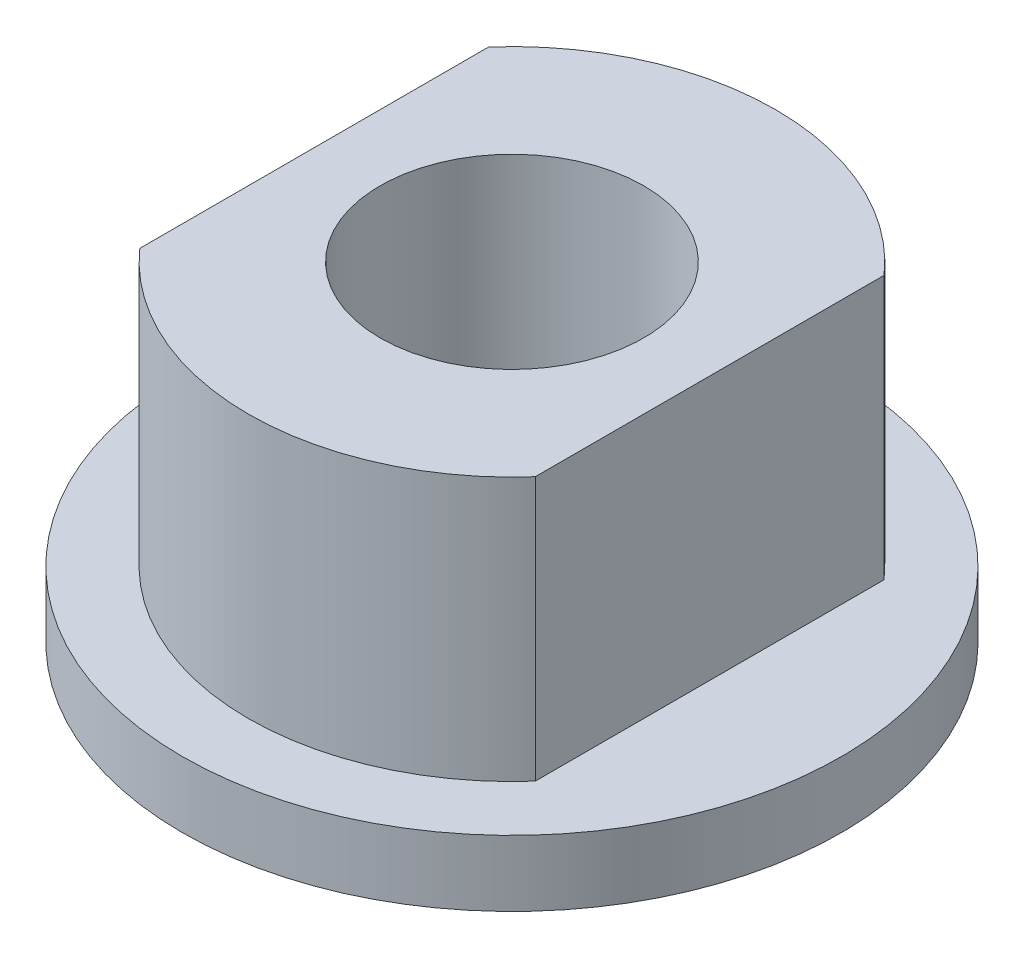
ISO-10303-21;
HEADER;
FILE_DESCRIPTION(('STEP AP214'),'2;1');
FILE_NAME('part.step','',(''),(''),'','','');
FILE_SCHEMA(('AUTOMOTIVE_DESIGN { 1 0 10303 214 1 1 1 1 }'));
ENDSEC;
DATA;
#1=APPLICATION_CONTEXT('core data for automotive mechanical design processes');
#2=APPLICATION_PROTOCOL_DEFINITION('international standard','automotive_design',2000,#1);
#3=PRODUCT_CONTEXT('',#1,'mechanical');
#4=PRODUCT('Part','Part','',(#3));
#5=PRODUCT_RELATED_PRODUCT_CATEGORY('part','',(#4));
#6=PRODUCT_DEFINITION_FORMATION('','',#4);
#7=PRODUCT_DEFINITION_CONTEXT('part definition',#1,'design');
#8=PRODUCT_DEFINITION('design','',#6,#7);
#9=PRODUCT_DEFINITION_SHAPE('','',#8);
#10=(LENGTH_UNIT() NAMED_UNIT(*) SI_UNIT(.MILLI.,.METRE.));
#11=(NAMED_UNIT(*) PLANE_ANGLE_UNIT() SI_UNIT($,.RADIAN.));
#12=(NAMED_UNIT(*) SI_UNIT($,.STERADIAN.) SOLID_ANGLE_UNIT());
#13=UNCERTAINTY_MEASURE_WITH_UNIT(LENGTH_MEASURE(1.E-05),#10,'distance_accuracy_value','');
#14=(GEOMETRIC_REPRESENTATION_CONTEXT(3) GLOBAL_UNCERTAINTY_ASSIGNED_CONTEXT((#13)) GLOBAL_UNIT_ASSIGNED_CONTEXT((#10,
#11,#12)) REPRESENTATION_CONTEXT('',''));
#15=CARTESIAN_POINT('',(0.,0.,0.));
#16=DIRECTION('',(0.,0.,1.));
#17=DIRECTION('',(1.,0.,0.));
#18=AXIS2_PLACEMENT_3D('',#15,#16,#17);
#19=CARTESIAN_POINT('',(0.,2.5,0.));
#20=DIRECTION('',(0.,-1.,0.));
#21=DIRECTION('',(0.,0.,-1.));
#22=AXIS2_PLACEMENT_3D('',#19,#20,#21);
#23=CYLINDRICAL_SURFACE('',#22,12.5);
#24=CARTESIAN_POINT('',(0.,2.5,0.));
#25=DIRECTION('',(0.,1.,0.));
#26=DIRECTION('',(0.,0.,1.));
#27=AXIS2_PLACEMENT_3D('',#24,#25,#26);
#28=CIRCLE('',#27,12.5);
#29=CARTESIAN_POINT('',(0.,2.5,12.5));
#30=VERTEX_POINT('',#29);
#31=EDGE_CURVE('E11',#30,#30,#28,.T.);
#32=ORIENTED_EDGE('',*,*,#31,.F.);
#33=EDGE_LOOP('',(#32));
#34=FACE_BOUND('',#33,.T.);
#35=CARTESIAN_POINT('',(0.,0.,0.));
#36=DIRECTION('',(0.,1.,0.));
#37=DIRECTION('',(0.,0.,1.));
#38=AXIS2_PLACEMENT_3D('',#35,#36,#37);
#39=CIRCLE('',#38,12.5);
#40=CARTESIAN_POINT('',(0.,0.,12.5));
#41=VERTEX_POINT('',#40);
#42=EDGE_CURVE('E39',#41,#41,#39,.T.);
#43=ORIENTED_EDGE('',*,*,#42,.T.);
#44=EDGE_LOOP('',(#43));
#45=FACE_BOUND('',#44,.T.);
#46=ADVANCED_FACE('F36',(#34,#45),#23,.T.);
#47=CARTESIAN_POINT('',(0.,2.5,0.));
#48=DIRECTION('',(0.,1.,0.));
#49=DIRECTION('',(0.,0.,1.));
#50=AXIS2_PLACEMENT_3D('',#47,#48,#49);
#51=PLANE('',#50);
#52=CARTESIAN_POINT('',(0.,2.5,0.));
#53=DIRECTION('',(0.,1.,0.));
#54=DIRECTION('',(0.,0.,1.));
#55=AXIS2_PLACEMENT_3D('',#52,#53,#54);
#56=CIRCLE('',#55,10.);
#57=CARTESIAN_POINT('',(-7.5,2.5,6.61437827766148));
#58=VERTEX_POINT('',#57);
#59=CARTESIAN_POINT('',(7.5,2.5,6.61437827766147));
#60=VERTEX_POINT('',#59);
#61=EDGE_CURVE('E50',#58,#60,#56,.T.);
#62=ORIENTED_EDGE('',*,*,#61,.F.);
#63=DIRECTION('',(0.,0.,1.));
#64=VECTOR('',#63,1.);
#65=CARTESIAN_POINT('',(-7.5,2.5,-6.61437827766148));
#66=LINE('',#65,#64);
#67=CARTESIAN_POINT('',(-7.5,2.5,-6.61437827766148));
#68=VERTEX_POINT('',#67);
#69=EDGE_CURVE('E54',#68,#58,#66,.T.);
#70=ORIENTED_EDGE('',*,*,#69,.F.);
#71=CARTESIAN_POINT('',(0.,2.5,0.));
#72=DIRECTION('',(0.,1.,0.));
#73=DIRECTION('',(0.,0.,1.));
#74=AXIS2_PLACEMENT_3D('',#71,#72,#73);
#75=CIRCLE('',#74,10.);
#76=CARTESIAN_POINT('',(7.5,2.5,-6.61437827766147));
#77=VERTEX_POINT('',#76);
#78=EDGE_CURVE('E106',#77,#68,#75,.T.);
#79=ORIENTED_EDGE('',*,*,#78,.F.);
#80=DIRECTION('',(0.,0.,-1.));
#81=VECTOR('',#80,1.);
#82=CARTESIAN_POINT('',(7.5,2.5,6.61437827766147));
#83=LINE('',#82,#81);
#84=EDGE_CURVE('E108',#60,#77,#83,.T.);
#85=ORIENTED_EDGE('',*,*,#84,.F.);
#86=EDGE_LOOP('',(#62,#70,#79,#85));
#87=FACE_BOUND('',#86,.T.);
#88=ORIENTED_EDGE('',*,*,#31,.T.);
#89=EDGE_LOOP('',(#88));
#90=FACE_BOUND('',#89,.T.);
#91=ADVANCED_FACE('F139',(#87,#90),#51,.T.);
#92=CARTESIAN_POINT('',(0.,0.,0.));
#93=DIRECTION('',(0.,1.,0.));
#94=DIRECTION('',(0.,0.,1.));
#95=AXIS2_PLACEMENT_3D('',#92,#93,#94);
#96=PLANE('',#95);
#97=CARTESIAN_POINT('',(0.,0.,0.));
#98=DIRECTION('',(0.,1.,0.));
#99=DIRECTION('',(0.,0.,1.));
#100=AXIS2_PLACEMENT_3D('',#97,#98,#99);
#101=CIRCLE('',#100,5.);
#102=CARTESIAN_POINT('',(0.,0.,5.));
#103=VERTEX_POINT('',#102);
#104=EDGE_CURVE('E111',#103,#103,#101,.T.);
#105=ORIENTED_EDGE('',*,*,#104,.T.);
#106=EDGE_LOOP('',(#105));
#107=FACE_BOUND('',#106,.T.);
#108=ORIENTED_EDGE('',*,*,#42,.F.);
#109=EDGE_LOOP('',(#108));
#110=FACE_BOUND('',#109,.T.);
#111=ADVANCED_FACE('F120',(#107,#110),#96,.F.);
#112=CARTESIAN_POINT('',(0.,12.5,0.));
#113=DIRECTION('',(0.,-1.,0.));
#114=DIRECTION('',(0.,0.,-1.));
#115=AXIS2_PLACEMENT_3D('',#112,#113,#114);
#116=CYLINDRICAL_SURFACE('',#115,10.);
#117=ORIENTED_EDGE('',*,*,#61,.T.);
#118=DIRECTION('',(0.,-1.,0.));
#119=VECTOR('',#118,1.);
#120=CARTESIAN_POINT('',(7.5,12.5,6.61437827766147));
#121=LINE('',#120,#119);
#122=CARTESIAN_POINT('',(7.5,12.5,6.61437827766147));
#123=VERTEX_POINT('',#122);
#124=EDGE_CURVE('E79',#123,#60,#121,.T.);
#125=ORIENTED_EDGE('',*,*,#124,.F.);
#126=CARTESIAN_POINT('',(0.,12.5,0.));
#127=DIRECTION('',(0.,1.,0.));
#128=DIRECTION('',(0.,0.,1.));
#129=AXIS2_PLACEMENT_3D('',#126,#127,#128);
#130=CIRCLE('',#129,10.);
#131=CARTESIAN_POINT('',(-7.5,12.5,6.61437827766148));
#132=VERTEX_POINT('',#131);
#133=EDGE_CURVE('E85',#132,#123,#130,.T.);
#134=ORIENTED_EDGE('',*,*,#133,.F.);
#135=DIRECTION('',(0.,-1.,0.));
#136=VECTOR('',#135,1.);
#137=CARTESIAN_POINT('',(-7.5,12.5,6.61437827766148));
#138=LINE('',#137,#136);
#139=EDGE_CURVE('E103',#132,#58,#138,.T.);
#140=ORIENTED_EDGE('',*,*,#139,.T.);
#141=EDGE_LOOP('',(#117,#125,#134,#140));
#142=FACE_BOUND('',#141,.T.);
#143=ADVANCED_FACE('F95',(#142),#116,.T.);
#144=CARTESIAN_POINT('',(7.5,12.5,6.61437827766147));
#145=DIRECTION('',(-1.,0.,0.));
#146=DIRECTION('',(0.,0.,1.));
#147=AXIS2_PLACEMENT_3D('',#144,#145,#146);
#148=PLANE('',#147);
#149=ORIENTED_EDGE('',*,*,#84,.T.);
#150=DIRECTION('',(0.,-1.,0.));
#151=VECTOR('',#150,1.);
#152=CARTESIAN_POINT('',(7.5,12.5,-6.61437827766147));
#153=LINE('',#152,#151);
#154=CARTESIAN_POINT('',(7.5,12.5,-6.61437827766147));
#155=VERTEX_POINT('',#154);
#156=EDGE_CURVE('E81',#155,#77,#153,.T.);
#157=ORIENTED_EDGE('',*,*,#156,.F.);
#158=DIRECTION('',(0.,0.,-1.));
#159=VECTOR('',#158,1.);
#160=CARTESIAN_POINT('',(7.5,12.5,6.61437827766147));
#161=LINE('',#160,#159);
#162=EDGE_CURVE('E74',#123,#155,#161,.T.);
#163=ORIENTED_EDGE('',*,*,#162,.F.);
#164=ORIENTED_EDGE('',*,*,#124,.T.);
#165=EDGE_LOOP('',(#149,#157,#163,#164));
#166=FACE_BOUND('',#165,.T.);
#167=ADVANCED_FACE('F77',(#166),#148,.F.);
#168=CARTESIAN_POINT('',(0.,12.5,0.));
#169=DIRECTION('',(0.,-1.,0.));
#170=DIRECTION('',(0.,0.,-1.));
#171=AXIS2_PLACEMENT_3D('',#168,#169,#170);
#172=CYLINDRICAL_SURFACE('',#171,10.);
#173=ORIENTED_EDGE('',*,*,#78,.T.);
#174=DIRECTION('',(0.,-1.,0.));
#175=VECTOR('',#174,1.);
#176=CARTESIAN_POINT('',(-7.5,12.5,-6.61437827766148));
#177=LINE('',#176,#175);
#178=CARTESIAN_POINT('',(-7.5,12.5,-6.61437827766148));
#179=VERTEX_POINT('',#178);
#180=EDGE_CURVE('E98',#179,#68,#177,.T.);
#181=ORIENTED_EDGE('',*,*,#180,.F.);
#182=CARTESIAN_POINT('',(0.,12.5,0.));
#183=DIRECTION('',(0.,1.,0.));
#184=DIRECTION('',(0.,0.,1.));
#185=AXIS2_PLACEMENT_3D('',#182,#183,#184);
#186=CIRCLE('',#185,10.);
#187=EDGE_CURVE('E84',#155,#179,#186,.T.);
#188=ORIENTED_EDGE('',*,*,#187,.F.);
#189=ORIENTED_EDGE('',*,*,#156,.T.);
#190=EDGE_LOOP('',(#173,#181,#188,#189));
#191=FACE_BOUND('',#190,.T.);
#192=ADVANCED_FACE('F135',(#191),#172,.T.);
#193=CARTESIAN_POINT('',(-7.5,12.5,-6.61437827766148));
#194=DIRECTION('',(1.,0.,0.));
#195=DIRECTION('',(0.,0.,-1.));
#196=AXIS2_PLACEMENT_3D('',#193,#194,#195);
#197=PLANE('',#196);
#198=ORIENTED_EDGE('',*,*,#69,.T.);
#199=ORIENTED_EDGE('',*,*,#139,.F.);
#200=DIRECTION('',(0.,0.,1.));
#201=VECTOR('',#200,1.);
#202=CARTESIAN_POINT('',(-7.5,12.5,-6.61437827766148));
#203=LINE('',#202,#201);
#204=EDGE_CURVE('E90',#179,#132,#203,.T.);
#205=ORIENTED_EDGE('',*,*,#204,.F.);
#206=ORIENTED_EDGE('',*,*,#180,.T.);
#207=EDGE_LOOP('',(#198,#199,#205,#206));
#208=FACE_BOUND('',#207,.T.);
#209=ADVANCED_FACE('F130',(#208),#197,.F.);
#210=CARTESIAN_POINT('',(0.,12.5,0.));
#211=DIRECTION('',(0.,1.,0.));
#212=DIRECTION('',(0.,0.,1.));
#213=AXIS2_PLACEMENT_3D('',#210,#211,#212);
#214=PLANE('',#213);
#215=CARTESIAN_POINT('',(0.,12.5,0.));
#216=DIRECTION('',(0.,1.,0.));
#217=DIRECTION('',(0.,0.,1.));
#218=AXIS2_PLACEMENT_3D('',#215,#216,#217);
#219=CIRCLE('',#218,5.);
#220=CARTESIAN_POINT('',(0.,12.5,5.));
#221=VERTEX_POINT('',#220);
#222=EDGE_CURVE('E114',#221,#221,#219,.T.);
#223=ORIENTED_EDGE('',*,*,#222,.F.);
#224=EDGE_LOOP('',(#223));
#225=FACE_BOUND('',#224,.T.);
#226=ORIENTED_EDGE('',*,*,#133,.T.);
#227=ORIENTED_EDGE('',*,*,#162,.T.);
#228=ORIENTED_EDGE('',*,*,#187,.T.);
#229=ORIENTED_EDGE('',*,*,#204,.T.);
#230=EDGE_LOOP('',(#226,#227,#228,#229));
#231=FACE_BOUND('',#230,.T.);
#232=ADVANCED_FACE('F88',(#225,#231),#214,.T.);
#233=CARTESIAN_POINT('',(0.,0.,0.));
#234=DIRECTION('',(0.,1.,0.));
#235=DIRECTION('',(0.,0.,1.));
#236=AXIS2_PLACEMENT_3D('',#233,#234,#235);
#237=CYLINDRICAL_SURFACE('',#236,5.);
#238=ORIENTED_EDGE('',*,*,#104,.F.);
#239=EDGE_LOOP('',(#238));
#240=FACE_BOUND('',#239,.T.);
#241=ORIENTED_EDGE('',*,*,#222,.T.);
#242=EDGE_LOOP('',(#241));
#243=FACE_BOUND('',#242,.T.);
#244=ADVANCED_FACE('F123',(#240,#243),#237,.F.);
#245=CLOSED_SHELL('',(#46,#91,#111,#143,#167,#192,#209,#232,#244));
#246=MANIFOLD_SOLID_BREP('B2',#245);
#247=ADVANCED_BREP_SHAPE_REPRESENTATION('',(#18,#246),#14);
#248=SHAPE_DEFINITION_REPRESENTATION(#9,#247);
ENDSEC;
END-ISO-10303-21;
